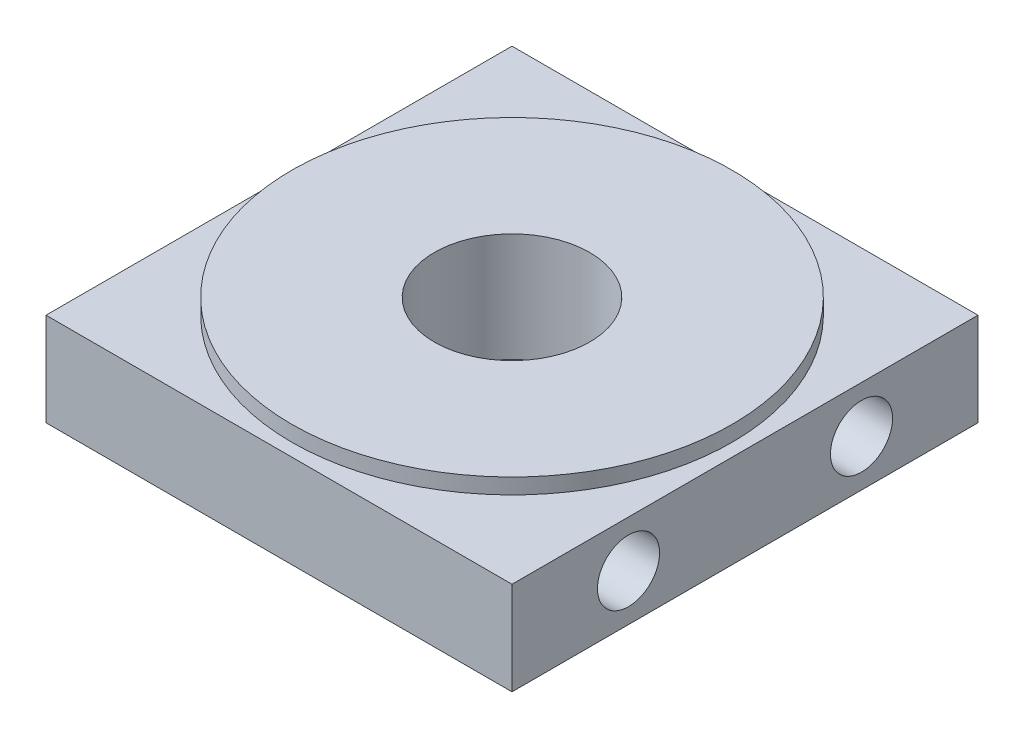
ISO-10303-21;
HEADER;
FILE_DESCRIPTION(('STEP AP214'),'2;1');
FILE_NAME('part.step','',(''),(''),'','','');
FILE_SCHEMA(('AUTOMOTIVE_DESIGN { 1 0 10303 214 1 1 1 1 }'));
ENDSEC;
DATA;
#1=APPLICATION_CONTEXT('core data for automotive mechanical design processes');
#2=APPLICATION_PROTOCOL_DEFINITION('international standard','automotive_design',2000,#1);
#3=PRODUCT_CONTEXT('',#1,'mechanical');
#4=PRODUCT('Part','Part','',(#3));
#5=PRODUCT_RELATED_PRODUCT_CATEGORY('part','',(#4));
#6=PRODUCT_DEFINITION_FORMATION('','',#4);
#7=PRODUCT_DEFINITION_CONTEXT('part definition',#1,'design');
#8=PRODUCT_DEFINITION('design','',#6,#7);
#9=PRODUCT_DEFINITION_SHAPE('','',#8);
#10=(LENGTH_UNIT() NAMED_UNIT(*) SI_UNIT(.MILLI.,.METRE.));
#11=(NAMED_UNIT(*) PLANE_ANGLE_UNIT() SI_UNIT($,.RADIAN.));
#12=(NAMED_UNIT(*) SI_UNIT($,.STERADIAN.) SOLID_ANGLE_UNIT());
#13=UNCERTAINTY_MEASURE_WITH_UNIT(LENGTH_MEASURE(1.E-05),#10,'distance_accuracy_value','');
#14=(GEOMETRIC_REPRESENTATION_CONTEXT(3) GLOBAL_UNCERTAINTY_ASSIGNED_CONTEXT((#13)) GLOBAL_UNIT_ASSIGNED_CONTEXT((#10,
#11,#12)) REPRESENTATION_CONTEXT('',''));
#15=CARTESIAN_POINT('',(0.,0.,0.));
#16=DIRECTION('',(0.,0.,1.));
#17=DIRECTION('',(1.,0.,0.));
#18=AXIS2_PLACEMENT_3D('',#15,#16,#17);
#19=CARTESIAN_POINT('',(18.1239583333333,7.62,-21.5635416666667));
#20=DIRECTION('',(-1.,0.,0.));
#21=DIRECTION('',(0.,0.,1.));
#22=AXIS2_PLACEMENT_3D('',#19,#20,#21);
#23=PLANE('',#22);
#24=CARTESIAN_POINT('',(18.1239583333333,3.81,-12.0385416666667));
#25=DIRECTION('',(1.,0.,0.));
#26=DIRECTION('',(0.,0.,-1.));
#27=AXIS2_PLACEMENT_3D('',#24,#25,#26);
#28=CIRCLE('',#27,2.54);
#29=CARTESIAN_POINT('',(18.1239583333333,3.81,-14.5785416666667));
#30=VERTEX_POINT('',#29);
#31=EDGE_CURVE('E139',#30,#30,#28,.T.);
#32=ORIENTED_EDGE('',*,*,#31,.F.);
#33=EDGE_LOOP('',(#32));
#34=FACE_BOUND('',#33,.T.);
#35=CARTESIAN_POINT('',(18.1239583333333,3.81,7.01145833333331));
#36=DIRECTION('',(1.,0.,0.));
#37=DIRECTION('',(0.,0.,-1.));
#38=AXIS2_PLACEMENT_3D('',#35,#36,#37);
#39=CIRCLE('',#38,2.54);
#40=CARTESIAN_POINT('',(18.1239583333333,3.81,4.47145833333331));
#41=VERTEX_POINT('',#40);
#42=EDGE_CURVE('E133',#41,#41,#39,.T.);
#43=ORIENTED_EDGE('',*,*,#42,.F.);
#44=EDGE_LOOP('',(#43));
#45=FACE_BOUND('',#44,.T.);
#46=DIRECTION('',(0.,0.,-1.));
#47=VECTOR('',#46,1.);
#48=CARTESIAN_POINT('',(18.1239583333333,0.,-21.5635416666667));
#49=LINE('',#48,#47);
#50=CARTESIAN_POINT('',(18.1239583333333,0.,16.5364583333333));
#51=VERTEX_POINT('',#50);
#52=CARTESIAN_POINT('',(18.1239583333333,0.,-21.5635416666667));
#53=VERTEX_POINT('',#52);
#54=EDGE_CURVE('E95',#51,#53,#49,.T.);
#55=ORIENTED_EDGE('',*,*,#54,.T.);
#56=DIRECTION('',(0.,-1.,0.));
#57=VECTOR('',#56,1.);
#58=CARTESIAN_POINT('',(18.1239583333333,7.62,-21.5635416666667));
#59=LINE('',#58,#57);
#60=CARTESIAN_POINT('',(18.1239583333333,7.62,-21.5635416666667));
#61=VERTEX_POINT('',#60);
#62=EDGE_CURVE('E11',#61,#53,#59,.T.);
#63=ORIENTED_EDGE('',*,*,#62,.F.);
#64=DIRECTION('',(0.,0.,-1.));
#65=VECTOR('',#64,1.);
#66=CARTESIAN_POINT('',(18.1239583333333,7.62,-21.5635416666667));
#67=LINE('',#66,#65);
#68=CARTESIAN_POINT('',(18.1239583333333,7.62,16.5364583333333));
#69=VERTEX_POINT('',#68);
#70=EDGE_CURVE('E83',#69,#61,#67,.T.);
#71=ORIENTED_EDGE('',*,*,#70,.F.);
#72=DIRECTION('',(0.,-1.,0.));
#73=VECTOR('',#72,1.);
#74=CARTESIAN_POINT('',(18.1239583333333,7.62,16.5364583333333));
#75=LINE('',#74,#73);
#76=EDGE_CURVE('E91',#69,#51,#75,.T.);
#77=ORIENTED_EDGE('',*,*,#76,.T.);
#78=EDGE_LOOP('',(#55,#63,#71,#77));
#79=FACE_BOUND('',#78,.T.);
#80=ADVANCED_FACE('F32',(#34,#45,#79),#23,.F.);
#81=CARTESIAN_POINT('',(-19.9760416666667,7.62,-21.5635416666667));
#82=DIRECTION('',(0.,0.,1.));
#83=DIRECTION('',(1.,0.,0.));
#84=AXIS2_PLACEMENT_3D('',#81,#82,#83);
#85=PLANE('',#84);
#86=DIRECTION('',(-1.,0.,0.));
#87=VECTOR('',#86,1.);
#88=CARTESIAN_POINT('',(-19.9760416666667,0.,-21.5635416666667));
#89=LINE('',#88,#87);
#90=CARTESIAN_POINT('',(-19.9760416666667,0.,-21.5635416666667));
#91=VERTEX_POINT('',#90);
#92=EDGE_CURVE('E87',#53,#91,#89,.T.);
#93=ORIENTED_EDGE('',*,*,#92,.T.);
#94=DIRECTION('',(0.,-1.,0.));
#95=VECTOR('',#94,1.);
#96=CARTESIAN_POINT('',(-19.9760416666667,7.62,-21.5635416666667));
#97=LINE('',#96,#95);
#98=CARTESIAN_POINT('',(-19.9760416666667,7.62,-21.5635416666667));
#99=VERTEX_POINT('',#98);
#100=EDGE_CURVE('E40',#99,#91,#97,.T.);
#101=ORIENTED_EDGE('',*,*,#100,.F.);
#102=DIRECTION('',(-1.,0.,0.));
#103=VECTOR('',#102,1.);
#104=CARTESIAN_POINT('',(-19.9760416666667,7.62,-21.5635416666667));
#105=LINE('',#104,#103);
#106=EDGE_CURVE('E78',#61,#99,#105,.T.);
#107=ORIENTED_EDGE('',*,*,#106,.F.);
#108=ORIENTED_EDGE('',*,*,#62,.T.);
#109=EDGE_LOOP('',(#93,#101,#107,#108));
#110=FACE_BOUND('',#109,.T.);
#111=ADVANCED_FACE('F86',(#110),#85,.F.);
#112=CARTESIAN_POINT('',(-19.9760416666667,7.62,-21.5635416666667));
#113=DIRECTION('',(1.,0.,0.));
#114=DIRECTION('',(0.,0.,-1.));
#115=AXIS2_PLACEMENT_3D('',#112,#113,#114);
#116=PLANE('',#115);
#117=CARTESIAN_POINT('',(-19.9760416666667,3.81,7.01145833333331));
#118=DIRECTION('',(-1.,0.,0.));
#119=DIRECTION('',(0.,0.,1.));
#120=AXIS2_PLACEMENT_3D('',#117,#118,#119);
#121=CIRCLE('',#120,2.54);
#122=CARTESIAN_POINT('',(-19.9760416666667,3.81,9.55145833333331));
#123=VERTEX_POINT('',#122);
#124=EDGE_CURVE('E127',#123,#123,#121,.T.);
#125=ORIENTED_EDGE('',*,*,#124,.F.);
#126=EDGE_LOOP('',(#125));
#127=FACE_BOUND('',#126,.T.);
#128=CARTESIAN_POINT('',(-19.9760416666667,3.81,-12.0385416666667));
#129=DIRECTION('',(-1.,0.,0.));
#130=DIRECTION('',(0.,0.,1.));
#131=AXIS2_PLACEMENT_3D('',#128,#129,#130);
#132=CIRCLE('',#131,2.54);
#133=CARTESIAN_POINT('',(-19.9760416666667,3.81,-9.49854166666669));
#134=VERTEX_POINT('',#133);
#135=EDGE_CURVE('E121',#134,#134,#132,.T.);
#136=ORIENTED_EDGE('',*,*,#135,.F.);
#137=EDGE_LOOP('',(#136));
#138=FACE_BOUND('',#137,.T.);
#139=DIRECTION('',(0.,0.,1.));
#140=VECTOR('',#139,1.);
#141=CARTESIAN_POINT('',(-19.9760416666667,0.,-21.5635416666667));
#142=LINE('',#141,#140);
#143=CARTESIAN_POINT('',(-19.9760416666667,0.,16.5364583333333));
#144=VERTEX_POINT('',#143);
#145=EDGE_CURVE('E65',#91,#144,#142,.T.);
#146=ORIENTED_EDGE('',*,*,#145,.T.);
#147=DIRECTION('',(0.,-1.,0.));
#148=VECTOR('',#147,1.);
#149=CARTESIAN_POINT('',(-19.9760416666667,7.62,16.5364583333333));
#150=LINE('',#149,#148);
#151=CARTESIAN_POINT('',(-19.9760416666667,7.62,16.5364583333333));
#152=VERTEX_POINT('',#151);
#153=EDGE_CURVE('E88',#152,#144,#150,.T.);
#154=ORIENTED_EDGE('',*,*,#153,.F.);
#155=DIRECTION('',(0.,0.,1.));
#156=VECTOR('',#155,1.);
#157=CARTESIAN_POINT('',(-19.9760416666667,7.62,-21.5635416666667));
#158=LINE('',#157,#156);
#159=EDGE_CURVE('E81',#99,#152,#158,.T.);
#160=ORIENTED_EDGE('',*,*,#159,.F.);
#161=ORIENTED_EDGE('',*,*,#100,.T.);
#162=EDGE_LOOP('',(#146,#154,#160,#161));
#163=FACE_BOUND('',#162,.T.);
#164=ADVANCED_FACE('F89',(#127,#138,#163),#116,.F.);
#165=CARTESIAN_POINT('',(-19.9760416666667,7.62,16.5364583333333));
#166=DIRECTION('',(0.,0.,-1.));
#167=DIRECTION('',(-1.,0.,0.));
#168=AXIS2_PLACEMENT_3D('',#165,#166,#167);
#169=PLANE('',#168);
#170=DIRECTION('',(1.,0.,0.));
#171=VECTOR('',#170,1.);
#172=CARTESIAN_POINT('',(-19.9760416666667,0.,16.5364583333333));
#173=LINE('',#172,#171);
#174=EDGE_CURVE('E71',#144,#51,#173,.T.);
#175=ORIENTED_EDGE('',*,*,#174,.T.);
#176=ORIENTED_EDGE('',*,*,#76,.F.);
#177=DIRECTION('',(1.,0.,0.));
#178=VECTOR('',#177,1.);
#179=CARTESIAN_POINT('',(-19.9760416666667,7.62,16.5364583333333));
#180=LINE('',#179,#178);
#181=EDGE_CURVE('E48',#152,#69,#180,.T.);
#182=ORIENTED_EDGE('',*,*,#181,.F.);
#183=ORIENTED_EDGE('',*,*,#153,.T.);
#184=EDGE_LOOP('',(#175,#176,#182,#183));
#185=FACE_BOUND('',#184,.T.);
#186=ADVANCED_FACE('F103',(#185),#169,.F.);
#187=CARTESIAN_POINT('',(0.,7.62,0.));
#188=DIRECTION('',(0.,1.,0.));
#189=DIRECTION('',(0.,0.,1.));
#190=AXIS2_PLACEMENT_3D('',#187,#188,#189);
#191=PLANE('',#190);
#192=CARTESIAN_POINT('',(-0.926041666666669,7.62,-2.51354166666669));
#193=DIRECTION('',(0.,1.,0.));
#194=DIRECTION('',(0.,0.,1.));
#195=AXIS2_PLACEMENT_3D('',#192,#193,#194);
#196=CIRCLE('',#195,18.);
#197=CARTESIAN_POINT('',(-0.926041666666669,7.62,15.4864583333333));
#198=VERTEX_POINT('',#197);
#199=EDGE_CURVE('E109',#198,#198,#196,.T.);
#200=ORIENTED_EDGE('',*,*,#199,.F.);
#201=EDGE_LOOP('',(#200));
#202=FACE_BOUND('',#201,.T.);
#203=ORIENTED_EDGE('',*,*,#70,.T.);
#204=ORIENTED_EDGE('',*,*,#106,.T.);
#205=ORIENTED_EDGE('',*,*,#159,.T.);
#206=ORIENTED_EDGE('',*,*,#181,.T.);
#207=EDGE_LOOP('',(#203,#204,#205,#206));
#208=FACE_BOUND('',#207,.T.);
#209=ADVANCED_FACE('F79',(#202,#208),#191,.T.);
#210=CARTESIAN_POINT('',(0.,0.,0.));
#211=DIRECTION('',(0.,1.,0.));
#212=DIRECTION('',(0.,0.,1.));
#213=AXIS2_PLACEMENT_3D('',#210,#211,#212);
#214=PLANE('',#213);
#215=CARTESIAN_POINT('',(-0.926041666666669,0.,-2.51354166666669));
#216=DIRECTION('',(0.,1.,0.));
#217=DIRECTION('',(0.,0.,1.));
#218=AXIS2_PLACEMENT_3D('',#215,#216,#217);
#219=CIRCLE('',#218,6.35);
#220=CARTESIAN_POINT('',(-0.926041666666669,0.,3.83645833333331));
#221=VERTEX_POINT('',#220);
#222=EDGE_CURVE('E117',#221,#221,#219,.T.);
#223=ORIENTED_EDGE('',*,*,#222,.T.);
#224=EDGE_LOOP('',(#223));
#225=FACE_BOUND('',#224,.T.);
#226=ORIENTED_EDGE('',*,*,#54,.F.);
#227=ORIENTED_EDGE('',*,*,#174,.F.);
#228=ORIENTED_EDGE('',*,*,#145,.F.);
#229=ORIENTED_EDGE('',*,*,#92,.F.);
#230=EDGE_LOOP('',(#226,#227,#228,#229));
#231=FACE_BOUND('',#230,.T.);
#232=ADVANCED_FACE('F106',(#225,#231),#214,.F.);
#233=CARTESIAN_POINT('',(-0.926041666666669,8.89,-2.51354166666669));
#234=DIRECTION('',(0.,1.,0.));
#235=DIRECTION('',(0.,0.,1.));
#236=AXIS2_PLACEMENT_3D('',#233,#234,#235);
#237=PLANE('',#236);
#238=CARTESIAN_POINT('',(-0.926041666666669,8.89,-2.51354166666669));
#239=DIRECTION('',(0.,1.,0.));
#240=DIRECTION('',(0.,0.,1.));
#241=AXIS2_PLACEMENT_3D('',#238,#239,#240);
#242=CIRCLE('',#241,18.);
#243=CARTESIAN_POINT('',(-0.926041666666669,8.89,15.4864583333333));
#244=VERTEX_POINT('',#243);
#245=EDGE_CURVE('E98',#244,#244,#242,.T.);
#246=ORIENTED_EDGE('',*,*,#245,.T.);
#247=EDGE_LOOP('',(#246));
#248=FACE_BOUND('',#247,.T.);
#249=CARTESIAN_POINT('',(-0.926041666666669,8.89,-2.51354166666669));
#250=DIRECTION('',(0.,1.,0.));
#251=DIRECTION('',(0.,0.,1.));
#252=AXIS2_PLACEMENT_3D('',#249,#250,#251);
#253=CIRCLE('',#252,6.35);
#254=CARTESIAN_POINT('',(-0.926041666666669,8.89,3.83645833333331));
#255=VERTEX_POINT('',#254);
#256=EDGE_CURVE('E112',#255,#255,#253,.T.);
#257=ORIENTED_EDGE('',*,*,#256,.F.);
#258=EDGE_LOOP('',(#257));
#259=FACE_BOUND('',#258,.T.);
#260=ADVANCED_FACE('F190',(#248,#259),#237,.T.);
#261=CARTESIAN_POINT('',(-0.926041666666669,8.89,-2.51354166666669));
#262=DIRECTION('',(0.,-1.,0.));
#263=DIRECTION('',(0.,0.,-1.));
#264=AXIS2_PLACEMENT_3D('',#261,#262,#263);
#265=CYLINDRICAL_SURFACE('',#264,18.);
#266=ORIENTED_EDGE('',*,*,#245,.F.);
#267=EDGE_LOOP('',(#266));
#268=FACE_BOUND('',#267,.T.);
#269=ORIENTED_EDGE('',*,*,#199,.T.);
#270=EDGE_LOOP('',(#269));
#271=FACE_BOUND('',#270,.T.);
#272=ADVANCED_FACE('F188',(#268,#271),#265,.T.);
#273=CARTESIAN_POINT('',(-0.926041666666669,8.89,-2.51354166666669));
#274=DIRECTION('',(0.,-1.,0.));
#275=DIRECTION('',(0.,0.,-1.));
#276=AXIS2_PLACEMENT_3D('',#273,#274,#275);
#277=CYLINDRICAL_SURFACE('',#276,6.35);
#278=ORIENTED_EDGE('',*,*,#256,.T.);
#279=EDGE_LOOP('',(#278));
#280=FACE_BOUND('',#279,.T.);
#281=ORIENTED_EDGE('',*,*,#222,.F.);
#282=EDGE_LOOP('',(#281));
#283=FACE_BOUND('',#282,.T.);
#284=ADVANCED_FACE('F184',(#280,#283),#277,.F.);
#285=CARTESIAN_POINT('',(-12.3560416666667,3.81,-12.0385416666667));
#286=DIRECTION('',(-1.,0.,0.));
#287=DIRECTION('',(0.,0.,1.));
#288=AXIS2_PLACEMENT_3D('',#285,#286,#287);
#289=CYLINDRICAL_SURFACE('',#288,2.54);
#290=CARTESIAN_POINT('',(-12.3560416666667,3.81,-12.0385416666667));
#291=DIRECTION('',(-1.,0.,0.));
#292=DIRECTION('',(0.,0.,1.));
#293=AXIS2_PLACEMENT_3D('',#290,#291,#292);
#294=CIRCLE('',#293,2.54);
#295=CARTESIAN_POINT('',(-12.3560416666667,3.81,-9.49854166666669));
#296=VERTEX_POINT('',#295);
#297=EDGE_CURVE('E120',#296,#296,#294,.T.);
#298=CARTESIAN_POINT('',(-12.3560416666667,3.81,-9.49854166666669));
#299=CARTESIAN_POINT('',(-12.4354166666667,3.81,-9.49854166666669));
#300=CARTESIAN_POINT('',(-12.5147916666667,3.81,-9.49854166666669));
#301=CARTESIAN_POINT('',(-12.6735416666667,3.81,-9.49854166666669));
#302=CARTESIAN_POINT('',(-12.7529166666667,3.81,-9.49854166666669));
#303=CARTESIAN_POINT('',(-12.9116666666667,3.81,-9.49854166666669));
#304=CARTESIAN_POINT('',(-12.9910416666667,3.81,-9.49854166666669));
#305=CARTESIAN_POINT('',(-13.1497916666667,3.81,-9.49854166666669));
#306=CARTESIAN_POINT('',(-13.2291666666667,3.81,-9.49854166666669));
#307=CARTESIAN_POINT('',(-13.3879166666667,3.81,-9.49854166666669));
#308=CARTESIAN_POINT('',(-13.4672916666667,3.81,-9.49854166666669));
#309=CARTESIAN_POINT('',(-13.6260416666667,3.81,-9.49854166666669));
#310=CARTESIAN_POINT('',(-13.7054166666667,3.81,-9.49854166666669));
#311=CARTESIAN_POINT('',(-13.8641666666667,3.81,-9.49854166666669));
#312=CARTESIAN_POINT('',(-13.9435416666667,3.81,-9.49854166666669));
#313=CARTESIAN_POINT('',(-14.1022916666667,3.81,-9.49854166666669));
#314=CARTESIAN_POINT('',(-14.1816666666667,3.81,-9.49854166666669));
#315=CARTESIAN_POINT('',(-14.3404166666667,3.81,-9.49854166666669));
#316=CARTESIAN_POINT('',(-14.4197916666667,3.81,-9.49854166666669));
#317=CARTESIAN_POINT('',(-14.5785416666667,3.81,-9.49854166666669));
#318=CARTESIAN_POINT('',(-14.6579166666667,3.81,-9.49854166666669));
#319=CARTESIAN_POINT('',(-14.8166666666667,3.81,-9.49854166666669));
#320=CARTESIAN_POINT('',(-14.8960416666667,3.81,-9.49854166666669));
#321=CARTESIAN_POINT('',(-15.0547916666667,3.81,-9.49854166666669));
#322=CARTESIAN_POINT('',(-15.1341666666667,3.81,-9.49854166666669));
#323=CARTESIAN_POINT('',(-15.2929166666667,3.81,-9.49854166666669));
#324=CARTESIAN_POINT('',(-15.3722916666667,3.81,-9.49854166666669));
#325=CARTESIAN_POINT('',(-15.5310416666667,3.81,-9.49854166666669));
#326=CARTESIAN_POINT('',(-15.6104166666667,3.81,-9.49854166666669));
#327=CARTESIAN_POINT('',(-15.7691666666667,3.81,-9.49854166666669));
#328=CARTESIAN_POINT('',(-15.8485416666667,3.81,-9.49854166666669));
#329=CARTESIAN_POINT('',(-16.0072916666667,3.81,-9.49854166666669));
#330=CARTESIAN_POINT('',(-16.0866666666667,3.81,-9.49854166666669));
#331=CARTESIAN_POINT('',(-16.2454166666667,3.81,-9.49854166666669));
#332=CARTESIAN_POINT('',(-16.3247916666667,3.81,-9.49854166666669));
#333=CARTESIAN_POINT('',(-16.4835416666667,3.81,-9.49854166666669));
#334=CARTESIAN_POINT('',(-16.5629166666667,3.81,-9.49854166666669));
#335=CARTESIAN_POINT('',(-16.7216666666667,3.81,-9.49854166666669));
#336=CARTESIAN_POINT('',(-16.8010416666667,3.81,-9.49854166666669));
#337=CARTESIAN_POINT('',(-16.9597916666667,3.81,-9.49854166666669));
#338=CARTESIAN_POINT('',(-17.0391666666667,3.81,-9.49854166666669));
#339=CARTESIAN_POINT('',(-17.1979166666667,3.81,-9.49854166666669));
#340=CARTESIAN_POINT('',(-17.2772916666667,3.81,-9.49854166666669));
#341=CARTESIAN_POINT('',(-17.4360416666667,3.81,-9.49854166666669));
#342=CARTESIAN_POINT('',(-17.5154166666667,3.81,-9.49854166666669));
#343=CARTESIAN_POINT('',(-17.6741666666667,3.81,-9.49854166666669));
#344=CARTESIAN_POINT('',(-17.7535416666667,3.81,-9.49854166666669));
#345=CARTESIAN_POINT('',(-17.9122916666667,3.81,-9.49854166666669));
#346=CARTESIAN_POINT('',(-17.9916666666667,3.81,-9.49854166666669));
#347=CARTESIAN_POINT('',(-18.1504166666667,3.81,-9.49854166666669));
#348=CARTESIAN_POINT('',(-18.2297916666667,3.81,-9.49854166666669));
#349=CARTESIAN_POINT('',(-18.3885416666667,3.81,-9.49854166666669));
#350=CARTESIAN_POINT('',(-18.4679166666667,3.81,-9.49854166666669));
#351=CARTESIAN_POINT('',(-18.6266666666667,3.81,-9.49854166666669));
#352=CARTESIAN_POINT('',(-18.7060416666667,3.81,-9.49854166666669));
#353=CARTESIAN_POINT('',(-18.8647916666667,3.81,-9.49854166666669));
#354=CARTESIAN_POINT('',(-18.9441666666667,3.81,-9.49854166666669));
#355=CARTESIAN_POINT('',(-19.1029166666667,3.81,-9.49854166666669));
#356=CARTESIAN_POINT('',(-19.1822916666667,3.81,-9.49854166666669));
#357=CARTESIAN_POINT('',(-19.3410416666667,3.81,-9.49854166666669));
#358=CARTESIAN_POINT('',(-19.4204166666667,3.81,-9.49854166666669));
#359=CARTESIAN_POINT('',(-19.5791666666667,3.81,-9.49854166666669));
#360=CARTESIAN_POINT('',(-19.6585416666667,3.81,-9.49854166666669));
#361=CARTESIAN_POINT('',(-19.8172916666667,3.81,-9.49854166666669));
#362=CARTESIAN_POINT('',(-19.8966666666667,3.81,-9.49854166666669));
#363=CARTESIAN_POINT('',(-19.9760416666667,3.81,-9.49854166666669));
#364=B_SPLINE_CURVE_WITH_KNOTS('',3,(#298,#299,#300,#301,#302,#303,#304,#305,#306,#307,#308,
#309,#310,#311,#312,#313,#314,#315,#316,#317,#318,#319,#320,#321,#322,#323,#324,#325,#326,#327,
#328,#329,#330,#331,#332,#333,#334,#335,#336,#337,#338,#339,#340,#341,#342,#343,#344,#345,#346,
#347,#348,#349,#350,#351,#352,#353,#354,#355,#356,#357,#358,#359,#360,#361,#362,#363),
.UNSPECIFIED.,.F.,.F.,(4,2,2,2,2,2,2,2,2,2,2,2,2,2,2,2,2,2,2,2,2,2,2,2,2,2,2,2,2,2,2,2,4),(0.,
0.238125,0.476250000000001,0.714375,0.9525,1.190625,1.42875,1.666875,1.905,2.143125,2.38125,
2.619375,2.8575,3.095625,3.33375,3.571875,3.81,4.048125,4.28625,4.524375,4.7625,5.000625,
5.23875,5.476875,5.715,5.953125,6.19125,6.429375,6.6675,6.905625,7.14375,7.381875,7.62),.UNSPECIFIED.);
#365=EDGE_CURVE('BSEAM180',#296,#134,#364,.T.);
#366=ORIENTED_EDGE('',*,*,#297,.F.);
#367=ORIENTED_EDGE('',*,*,#135,.T.);
#368=ORIENTED_EDGE('',*,*,#365,.T.);
#369=ORIENTED_EDGE('',*,*,#365,.F.);
#370=EDGE_LOOP('',(#366,#368,#367,#369));
#371=FACE_BOUND('',#370,.T.);
#372=ADVANCED_FACE('F180',(#371),#289,.F.);
#373=CARTESIAN_POINT('',(-12.3560416666667,3.81,-12.0385416666667));
#374=DIRECTION('',(-1.,0.,0.));
#375=DIRECTION('',(0.,0.,1.));
#376=AXIS2_PLACEMENT_3D('',#373,#374,#375);
#377=PLANE('',#376);
#378=ORIENTED_EDGE('',*,*,#297,.T.);
#379=EDGE_LOOP('',(#378));
#380=FACE_BOUND('',#379,.T.);
#381=ADVANCED_FACE('F176',(#380),#377,.T.);
#382=CARTESIAN_POINT('',(-12.3560416666667,3.81,7.01145833333331));
#383=DIRECTION('',(-1.,0.,0.));
#384=DIRECTION('',(0.,0.,1.));
#385=AXIS2_PLACEMENT_3D('',#382,#383,#384);
#386=CYLINDRICAL_SURFACE('',#385,2.54);
#387=CARTESIAN_POINT('',(-12.3560416666667,3.81,7.01145833333331));
#388=DIRECTION('',(-1.,0.,0.));
#389=DIRECTION('',(0.,0.,1.));
#390=AXIS2_PLACEMENT_3D('',#387,#388,#389);
#391=CIRCLE('',#390,2.54);
#392=CARTESIAN_POINT('',(-12.3560416666667,3.81,9.55145833333331));
#393=VERTEX_POINT('',#392);
#394=EDGE_CURVE('E124',#393,#393,#391,.T.);
#395=CARTESIAN_POINT('',(-12.3560416666667,3.81,9.55145833333331));
#396=CARTESIAN_POINT('',(-12.4354166666667,3.81,9.55145833333331));
#397=CARTESIAN_POINT('',(-12.5147916666667,3.81,9.55145833333331));
#398=CARTESIAN_POINT('',(-12.6735416666667,3.81,9.55145833333331));
#399=CARTESIAN_POINT('',(-12.7529166666667,3.81,9.55145833333331));
#400=CARTESIAN_POINT('',(-12.9116666666667,3.81,9.55145833333331));
#401=CARTESIAN_POINT('',(-12.9910416666667,3.81,9.55145833333331));
#402=CARTESIAN_POINT('',(-13.1497916666667,3.81,9.55145833333331));
#403=CARTESIAN_POINT('',(-13.2291666666667,3.81,9.55145833333331));
#404=CARTESIAN_POINT('',(-13.3879166666667,3.81,9.55145833333331));
#405=CARTESIAN_POINT('',(-13.4672916666667,3.81,9.55145833333331));
#406=CARTESIAN_POINT('',(-13.6260416666667,3.81,9.55145833333331));
#407=CARTESIAN_POINT('',(-13.7054166666667,3.81,9.55145833333331));
#408=CARTESIAN_POINT('',(-13.8641666666667,3.81,9.55145833333331));
#409=CARTESIAN_POINT('',(-13.9435416666667,3.81,9.55145833333331));
#410=CARTESIAN_POINT('',(-14.1022916666667,3.81,9.55145833333331));
#411=CARTESIAN_POINT('',(-14.1816666666667,3.81,9.55145833333331));
#412=CARTESIAN_POINT('',(-14.3404166666667,3.81,9.55145833333331));
#413=CARTESIAN_POINT('',(-14.4197916666667,3.81,9.55145833333331));
#414=CARTESIAN_POINT('',(-14.5785416666667,3.81,9.55145833333331));
#415=CARTESIAN_POINT('',(-14.6579166666667,3.81,9.55145833333331));
#416=CARTESIAN_POINT('',(-14.8166666666667,3.81,9.55145833333331));
#417=CARTESIAN_POINT('',(-14.8960416666667,3.81,9.55145833333331));
#418=CARTESIAN_POINT('',(-15.0547916666667,3.81,9.55145833333331));
#419=CARTESIAN_POINT('',(-15.1341666666667,3.81,9.55145833333331));
#420=CARTESIAN_POINT('',(-15.2929166666667,3.81,9.55145833333331));
#421=CARTESIAN_POINT('',(-15.3722916666667,3.81,9.55145833333331));
#422=CARTESIAN_POINT('',(-15.5310416666667,3.81,9.55145833333331));
#423=CARTESIAN_POINT('',(-15.6104166666667,3.81,9.55145833333331));
#424=CARTESIAN_POINT('',(-15.7691666666667,3.81,9.55145833333331));
#425=CARTESIAN_POINT('',(-15.8485416666667,3.81,9.55145833333331));
#426=CARTESIAN_POINT('',(-16.0072916666667,3.81,9.55145833333331));
#427=CARTESIAN_POINT('',(-16.0866666666667,3.81,9.55145833333331));
#428=CARTESIAN_POINT('',(-16.2454166666667,3.81,9.55145833333331));
#429=CARTESIAN_POINT('',(-16.3247916666667,3.81,9.55145833333331));
#430=CARTESIAN_POINT('',(-16.4835416666667,3.81,9.55145833333331));
#431=CARTESIAN_POINT('',(-16.5629166666667,3.81,9.55145833333331));
#432=CARTESIAN_POINT('',(-16.7216666666667,3.81,9.55145833333331));
#433=CARTESIAN_POINT('',(-16.8010416666667,3.81,9.55145833333331));
#434=CARTESIAN_POINT('',(-16.9597916666667,3.81,9.55145833333331));
#435=CARTESIAN_POINT('',(-17.0391666666667,3.81,9.55145833333331));
#436=CARTESIAN_POINT('',(-17.1979166666667,3.81,9.55145833333331));
#437=CARTESIAN_POINT('',(-17.2772916666667,3.81,9.55145833333331));
#438=CARTESIAN_POINT('',(-17.4360416666667,3.81,9.55145833333331));
#439=CARTESIAN_POINT('',(-17.5154166666667,3.81,9.55145833333331));
#440=CARTESIAN_POINT('',(-17.6741666666667,3.81,9.55145833333331));
#441=CARTESIAN_POINT('',(-17.7535416666667,3.81,9.55145833333331));
#442=CARTESIAN_POINT('',(-17.9122916666667,3.81,9.55145833333331));
#443=CARTESIAN_POINT('',(-17.9916666666667,3.81,9.55145833333331));
#444=CARTESIAN_POINT('',(-18.1504166666667,3.81,9.55145833333331));
#445=CARTESIAN_POINT('',(-18.2297916666667,3.81,9.55145833333331));
#446=CARTESIAN_POINT('',(-18.3885416666667,3.81,9.55145833333331));
#447=CARTESIAN_POINT('',(-18.4679166666667,3.81,9.55145833333331));
#448=CARTESIAN_POINT('',(-18.6266666666667,3.81,9.55145833333331));
#449=CARTESIAN_POINT('',(-18.7060416666667,3.81,9.55145833333331));
#450=CARTESIAN_POINT('',(-18.8647916666667,3.81,9.55145833333331));
#451=CARTESIAN_POINT('',(-18.9441666666667,3.81,9.55145833333331));
#452=CARTESIAN_POINT('',(-19.1029166666667,3.81,9.55145833333331));
#453=CARTESIAN_POINT('',(-19.1822916666667,3.81,9.55145833333331));
#454=CARTESIAN_POINT('',(-19.3410416666667,3.81,9.55145833333331));
#455=CARTESIAN_POINT('',(-19.4204166666667,3.81,9.55145833333331));
#456=CARTESIAN_POINT('',(-19.5791666666667,3.81,9.55145833333331));
#457=CARTESIAN_POINT('',(-19.6585416666667,3.81,9.55145833333331));
#458=CARTESIAN_POINT('',(-19.8172916666667,3.81,9.55145833333331));
#459=CARTESIAN_POINT('',(-19.8966666666667,3.81,9.55145833333331));
#460=CARTESIAN_POINT('',(-19.9760416666667,3.81,9.55145833333331));
#461=B_SPLINE_CURVE_WITH_KNOTS('',3,(#395,#396,#397,#398,#399,#400,#401,#402,#403,#404,#405,
#406,#407,#408,#409,#410,#411,#412,#413,#414,#415,#416,#417,#418,#419,#420,#421,#422,#423,#424,
#425,#426,#427,#428,#429,#430,#431,#432,#433,#434,#435,#436,#437,#438,#439,#440,#441,#442,#443,
#444,#445,#446,#447,#448,#449,#450,#451,#452,#453,#454,#455,#456,#457,#458,#459,#460),
.UNSPECIFIED.,.F.,.F.,(4,2,2,2,2,2,2,2,2,2,2,2,2,2,2,2,2,2,2,2,2,2,2,2,2,2,2,2,2,2,2,2,4),(0.,
0.238125,0.476250000000001,0.714375,0.9525,1.190625,1.42875,1.666875,1.905,2.143125,2.38125,
2.619375,2.8575,3.095625,3.33375,3.571875,3.81,4.048125,4.28625,4.524375,4.7625,5.000625,
5.23875,5.476875,5.715,5.953125,6.19125,6.429375,6.6675,6.905625,7.14375,7.381875,7.62),.UNSPECIFIED.);
#462=EDGE_CURVE('BSEAM169',#393,#123,#461,.T.);
#463=ORIENTED_EDGE('',*,*,#394,.F.);
#464=ORIENTED_EDGE('',*,*,#124,.T.);
#465=ORIENTED_EDGE('',*,*,#462,.T.);
#466=ORIENTED_EDGE('',*,*,#462,.F.);
#467=EDGE_LOOP('',(#463,#465,#464,#466));
#468=FACE_BOUND('',#467,.T.);
#469=ADVANCED_FACE('F169',(#468),#386,.F.);
#470=CARTESIAN_POINT('',(-12.3560416666667,3.81,7.01145833333331));
#471=DIRECTION('',(-1.,0.,0.));
#472=DIRECTION('',(0.,0.,1.));
#473=AXIS2_PLACEMENT_3D('',#470,#471,#472);
#474=PLANE('',#473);
#475=ORIENTED_EDGE('',*,*,#394,.T.);
#476=EDGE_LOOP('',(#475));
#477=FACE_BOUND('',#476,.T.);
#478=ADVANCED_FACE('F160',(#477),#474,.T.);
#479=CARTESIAN_POINT('',(10.5039583333333,3.81,7.01145833333331));
#480=DIRECTION('',(1.,0.,0.));
#481=DIRECTION('',(0.,0.,-1.));
#482=AXIS2_PLACEMENT_3D('',#479,#480,#481);
#483=CYLINDRICAL_SURFACE('',#482,2.54);
#484=CARTESIAN_POINT('',(10.5039583333333,3.81,7.01145833333331));
#485=DIRECTION('',(1.,0.,0.));
#486=DIRECTION('',(0.,0.,-1.));
#487=AXIS2_PLACEMENT_3D('',#484,#485,#486);
#488=CIRCLE('',#487,2.54);
#489=CARTESIAN_POINT('',(10.5039583333333,3.81,4.47145833333331));
#490=VERTEX_POINT('',#489);
#491=EDGE_CURVE('E130',#490,#490,#488,.T.);
#492=CARTESIAN_POINT('',(10.5039583333333,3.81,4.47145833333331));
#493=CARTESIAN_POINT('',(10.5833333333333,3.81,4.47145833333331));
#494=CARTESIAN_POINT('',(10.6627083333333,3.81,4.47145833333331));
#495=CARTESIAN_POINT('',(10.8214583333333,3.81,4.47145833333331));
#496=CARTESIAN_POINT('',(10.9008333333333,3.81,4.47145833333331));
#497=CARTESIAN_POINT('',(11.0595833333333,3.81,4.47145833333331));
#498=CARTESIAN_POINT('',(11.1389583333333,3.81,4.47145833333331));
#499=CARTESIAN_POINT('',(11.2977083333333,3.81,4.47145833333331));
#500=CARTESIAN_POINT('',(11.3770833333333,3.81,4.47145833333331));
#501=CARTESIAN_POINT('',(11.5358333333333,3.81,4.47145833333331));
#502=CARTESIAN_POINT('',(11.6152083333333,3.81,4.47145833333331));
#503=CARTESIAN_POINT('',(11.7739583333333,3.81,4.47145833333331));
#504=CARTESIAN_POINT('',(11.8533333333333,3.81,4.47145833333331));
#505=CARTESIAN_POINT('',(12.0120833333333,3.81,4.47145833333331));
#506=CARTESIAN_POINT('',(12.0914583333333,3.81,4.47145833333331));
#507=CARTESIAN_POINT('',(12.2502083333333,3.81,4.47145833333331));
#508=CARTESIAN_POINT('',(12.3295833333333,3.81,4.47145833333331));
#509=CARTESIAN_POINT('',(12.4883333333333,3.81,4.47145833333331));
#510=CARTESIAN_POINT('',(12.5677083333333,3.81,4.47145833333331));
#511=CARTESIAN_POINT('',(12.7264583333333,3.81,4.47145833333331));
#512=CARTESIAN_POINT('',(12.8058333333333,3.81,4.47145833333331));
#513=CARTESIAN_POINT('',(12.9645833333333,3.81,4.47145833333331));
#514=CARTESIAN_POINT('',(13.0439583333333,3.81,4.47145833333331));
#515=CARTESIAN_POINT('',(13.2027083333333,3.81,4.47145833333331));
#516=CARTESIAN_POINT('',(13.2820833333333,3.81,4.47145833333331));
#517=CARTESIAN_POINT('',(13.4408333333333,3.81,4.47145833333331));
#518=CARTESIAN_POINT('',(13.5202083333333,3.81,4.47145833333331));
#519=CARTESIAN_POINT('',(13.6789583333333,3.81,4.47145833333331));
#520=CARTESIAN_POINT('',(13.7583333333333,3.81,4.47145833333331));
#521=CARTESIAN_POINT('',(13.9170833333333,3.81,4.47145833333331));
#522=CARTESIAN_POINT('',(13.9964583333333,3.81,4.47145833333331));
#523=CARTESIAN_POINT('',(14.1552083333333,3.81,4.47145833333331));
#524=CARTESIAN_POINT('',(14.2345833333333,3.81,4.47145833333331));
#525=CARTESIAN_POINT('',(14.3933333333333,3.81,4.47145833333331));
#526=CARTESIAN_POINT('',(14.4727083333333,3.81,4.47145833333331));
#527=CARTESIAN_POINT('',(14.6314583333333,3.81,4.47145833333331));
#528=CARTESIAN_POINT('',(14.7108333333333,3.81,4.47145833333331));
#529=CARTESIAN_POINT('',(14.8695833333333,3.81,4.47145833333331));
#530=CARTESIAN_POINT('',(14.9489583333333,3.81,4.47145833333331));
#531=CARTESIAN_POINT('',(15.1077083333333,3.81,4.47145833333331));
#532=CARTESIAN_POINT('',(15.1870833333333,3.81,4.47145833333331));
#533=CARTESIAN_POINT('',(15.3458333333333,3.81,4.47145833333331));
#534=CARTESIAN_POINT('',(15.4252083333333,3.81,4.47145833333331));
#535=CARTESIAN_POINT('',(15.5839583333333,3.81,4.47145833333331));
#536=CARTESIAN_POINT('',(15.6633333333333,3.81,4.47145833333331));
#537=CARTESIAN_POINT('',(15.8220833333333,3.81,4.47145833333331));
#538=CARTESIAN_POINT('',(15.9014583333333,3.81,4.47145833333331));
#539=CARTESIAN_POINT('',(16.0602083333333,3.81,4.47145833333331));
#540=CARTESIAN_POINT('',(16.1395833333333,3.81,4.47145833333331));
#541=CARTESIAN_POINT('',(16.2983333333333,3.81,4.47145833333331));
#542=CARTESIAN_POINT('',(16.3777083333333,3.81,4.47145833333331));
#543=CARTESIAN_POINT('',(16.5364583333333,3.81,4.47145833333331));
#544=CARTESIAN_POINT('',(16.6158333333333,3.81,4.47145833333331));
#545=CARTESIAN_POINT('',(16.7745833333333,3.81,4.47145833333331));
#546=CARTESIAN_POINT('',(16.8539583333333,3.81,4.47145833333331));
#547=CARTESIAN_POINT('',(17.0127083333333,3.81,4.47145833333331));
#548=CARTESIAN_POINT('',(17.0920833333333,3.81,4.47145833333331));
#549=CARTESIAN_POINT('',(17.2508333333333,3.81,4.47145833333331));
#550=CARTESIAN_POINT('',(17.3302083333333,3.81,4.47145833333331));
#551=CARTESIAN_POINT('',(17.4889583333333,3.81,4.47145833333331));
#552=CARTESIAN_POINT('',(17.5683333333333,3.81,4.47145833333331));
#553=CARTESIAN_POINT('',(17.7270833333333,3.81,4.47145833333331));
#554=CARTESIAN_POINT('',(17.8064583333333,3.81,4.47145833333331));
#555=CARTESIAN_POINT('',(17.9652083333333,3.81,4.47145833333331));
#556=CARTESIAN_POINT('',(18.0445833333333,3.81,4.47145833333331));
#557=CARTESIAN_POINT('',(18.1239583333333,3.81,4.47145833333331));
#558=B_SPLINE_CURVE_WITH_KNOTS('',3,(#492,#493,#494,#495,#496,#497,#498,#499,#500,#501,#502,
#503,#504,#505,#506,#507,#508,#509,#510,#511,#512,#513,#514,#515,#516,#517,#518,#519,#520,#521,
#522,#523,#524,#525,#526,#527,#528,#529,#530,#531,#532,#533,#534,#535,#536,#537,#538,#539,#540,
#541,#542,#543,#544,#545,#546,#547,#548,#549,#550,#551,#552,#553,#554,#555,#556,#557),
.UNSPECIFIED.,.F.,.F.,(4,2,2,2,2,2,2,2,2,2,2,2,2,2,2,2,2,2,2,2,2,2,2,2,2,2,2,2,2,2,2,2,4),(0.,
0.238125,0.476250000000001,0.714375,0.9525,1.190625,1.42875,1.666875,1.905,2.143125,2.38125,
2.619375,2.8575,3.095625,3.33375,3.571875,3.81,4.048125,4.28625,4.524375,4.7625,5.000625,
5.23875,5.476875,5.715,5.953125,6.19125,6.429375,6.6675,6.905625,7.14375,7.381875,7.62),.UNSPECIFIED.);
#559=EDGE_CURVE('BSEAM158',#490,#41,#558,.T.);
#560=ORIENTED_EDGE('',*,*,#491,.F.);
#561=ORIENTED_EDGE('',*,*,#42,.T.);
#562=ORIENTED_EDGE('',*,*,#559,.T.);
#563=ORIENTED_EDGE('',*,*,#559,.F.);
#564=EDGE_LOOP('',(#560,#562,#561,#563));
#565=FACE_BOUND('',#564,.T.);
#566=ADVANCED_FACE('F158',(#565),#483,.F.);
#567=CARTESIAN_POINT('',(10.5039583333333,3.81,7.01145833333331));
#568=DIRECTION('',(1.,0.,0.));
#569=DIRECTION('',(0.,0.,-1.));
#570=AXIS2_PLACEMENT_3D('',#567,#568,#569);
#571=PLANE('',#570);
#572=ORIENTED_EDGE('',*,*,#491,.T.);
#573=EDGE_LOOP('',(#572));
#574=FACE_BOUND('',#573,.T.);
#575=ADVANCED_FACE('F150',(#574),#571,.T.);
#576=CARTESIAN_POINT('',(10.5039583333333,3.81,-12.0385416666667));
#577=DIRECTION('',(1.,0.,0.));
#578=DIRECTION('',(0.,0.,-1.));
#579=AXIS2_PLACEMENT_3D('',#576,#577,#578);
#580=CYLINDRICAL_SURFACE('',#579,2.54);
#581=CARTESIAN_POINT('',(10.5039583333333,3.81,-12.0385416666667));
#582=DIRECTION('',(1.,0.,0.));
#583=DIRECTION('',(0.,0.,-1.));
#584=AXIS2_PLACEMENT_3D('',#581,#582,#583);
#585=CIRCLE('',#584,2.54);
#586=CARTESIAN_POINT('',(10.5039583333333,3.81,-14.5785416666667));
#587=VERTEX_POINT('',#586);
#588=EDGE_CURVE('E136',#587,#587,#585,.T.);
#589=CARTESIAN_POINT('',(10.5039583333333,3.81,-14.5785416666667));
#590=CARTESIAN_POINT('',(10.5833333333333,3.81,-14.5785416666667));
#591=CARTESIAN_POINT('',(10.6627083333333,3.81,-14.5785416666667));
#592=CARTESIAN_POINT('',(10.8214583333333,3.81,-14.5785416666667));
#593=CARTESIAN_POINT('',(10.9008333333333,3.81,-14.5785416666667));
#594=CARTESIAN_POINT('',(11.0595833333333,3.81,-14.5785416666667));
#595=CARTESIAN_POINT('',(11.1389583333333,3.81,-14.5785416666667));
#596=CARTESIAN_POINT('',(11.2977083333333,3.81,-14.5785416666667));
#597=CARTESIAN_POINT('',(11.3770833333333,3.81,-14.5785416666667));
#598=CARTESIAN_POINT('',(11.5358333333333,3.81,-14.5785416666667));
#599=CARTESIAN_POINT('',(11.6152083333333,3.81,-14.5785416666667));
#600=CARTESIAN_POINT('',(11.7739583333333,3.81,-14.5785416666667));
#601=CARTESIAN_POINT('',(11.8533333333333,3.81,-14.5785416666667));
#602=CARTESIAN_POINT('',(12.0120833333333,3.81,-14.5785416666667));
#603=CARTESIAN_POINT('',(12.0914583333333,3.81,-14.5785416666667));
#604=CARTESIAN_POINT('',(12.2502083333333,3.81,-14.5785416666667));
#605=CARTESIAN_POINT('',(12.3295833333333,3.81,-14.5785416666667));
#606=CARTESIAN_POINT('',(12.4883333333333,3.81,-14.5785416666667));
#607=CARTESIAN_POINT('',(12.5677083333333,3.81,-14.5785416666667));
#608=CARTESIAN_POINT('',(12.7264583333333,3.81,-14.5785416666667));
#609=CARTESIAN_POINT('',(12.8058333333333,3.81,-14.5785416666667));
#610=CARTESIAN_POINT('',(12.9645833333333,3.81,-14.5785416666667));
#611=CARTESIAN_POINT('',(13.0439583333333,3.81,-14.5785416666667));
#612=CARTESIAN_POINT('',(13.2027083333333,3.81,-14.5785416666667));
#613=CARTESIAN_POINT('',(13.2820833333333,3.81,-14.5785416666667));
#614=CARTESIAN_POINT('',(13.4408333333333,3.81,-14.5785416666667));
#615=CARTESIAN_POINT('',(13.5202083333333,3.81,-14.5785416666667));
#616=CARTESIAN_POINT('',(13.6789583333333,3.81,-14.5785416666667));
#617=CARTESIAN_POINT('',(13.7583333333333,3.81,-14.5785416666667));
#618=CARTESIAN_POINT('',(13.9170833333333,3.81,-14.5785416666667));
#619=CARTESIAN_POINT('',(13.9964583333333,3.81,-14.5785416666667));
#620=CARTESIAN_POINT('',(14.1552083333333,3.81,-14.5785416666667));
#621=CARTESIAN_POINT('',(14.2345833333333,3.81,-14.5785416666667));
#622=CARTESIAN_POINT('',(14.3933333333333,3.81,-14.5785416666667));
#623=CARTESIAN_POINT('',(14.4727083333333,3.81,-14.5785416666667));
#624=CARTESIAN_POINT('',(14.6314583333333,3.81,-14.5785416666667));
#625=CARTESIAN_POINT('',(14.7108333333333,3.81,-14.5785416666667));
#626=CARTESIAN_POINT('',(14.8695833333333,3.81,-14.5785416666667));
#627=CARTESIAN_POINT('',(14.9489583333333,3.81,-14.5785416666667));
#628=CARTESIAN_POINT('',(15.1077083333333,3.81,-14.5785416666667));
#629=CARTESIAN_POINT('',(15.1870833333333,3.81,-14.5785416666667));
#630=CARTESIAN_POINT('',(15.3458333333333,3.81,-14.5785416666667));
#631=CARTESIAN_POINT('',(15.4252083333333,3.81,-14.5785416666667));
#632=CARTESIAN_POINT('',(15.5839583333333,3.81,-14.5785416666667));
#633=CARTESIAN_POINT('',(15.6633333333333,3.81,-14.5785416666667));
#634=CARTESIAN_POINT('',(15.8220833333333,3.81,-14.5785416666667));
#635=CARTESIAN_POINT('',(15.9014583333333,3.81,-14.5785416666667));
#636=CARTESIAN_POINT('',(16.0602083333333,3.81,-14.5785416666667));
#637=CARTESIAN_POINT('',(16.1395833333333,3.81,-14.5785416666667));
#638=CARTESIAN_POINT('',(16.2983333333333,3.81,-14.5785416666667));
#639=CARTESIAN_POINT('',(16.3777083333333,3.81,-14.5785416666667));
#640=CARTESIAN_POINT('',(16.5364583333333,3.81,-14.5785416666667));
#641=CARTESIAN_POINT('',(16.6158333333333,3.81,-14.5785416666667));
#642=CARTESIAN_POINT('',(16.7745833333333,3.81,-14.5785416666667));
#643=CARTESIAN_POINT('',(16.8539583333333,3.81,-14.5785416666667));
#644=CARTESIAN_POINT('',(17.0127083333333,3.81,-14.5785416666667));
#645=CARTESIAN_POINT('',(17.0920833333333,3.81,-14.5785416666667));
#646=CARTESIAN_POINT('',(17.2508333333333,3.81,-14.5785416666667));
#647=CARTESIAN_POINT('',(17.3302083333333,3.81,-14.5785416666667));
#648=CARTESIAN_POINT('',(17.4889583333333,3.81,-14.5785416666667));
#649=CARTESIAN_POINT('',(17.5683333333333,3.81,-14.5785416666667));
#650=CARTESIAN_POINT('',(17.7270833333333,3.81,-14.5785416666667));
#651=CARTESIAN_POINT('',(17.8064583333333,3.81,-14.5785416666667));
#652=CARTESIAN_POINT('',(17.9652083333333,3.81,-14.5785416666667));
#653=CARTESIAN_POINT('',(18.0445833333333,3.81,-14.5785416666667));
#654=CARTESIAN_POINT('',(18.1239583333333,3.81,-14.5785416666667));
#655=B_SPLINE_CURVE_WITH_KNOTS('',3,(#589,#590,#591,#592,#593,#594,#595,#596,#597,#598,#599,
#600,#601,#602,#603,#604,#605,#606,#607,#608,#609,#610,#611,#612,#613,#614,#615,#616,#617,#618,
#619,#620,#621,#622,#623,#624,#625,#626,#627,#628,#629,#630,#631,#632,#633,#634,#635,#636,#637,
#638,#639,#640,#641,#642,#643,#644,#645,#646,#647,#648,#649,#650,#651,#652,#653,#654),
.UNSPECIFIED.,.F.,.F.,(4,2,2,2,2,2,2,2,2,2,2,2,2,2,2,2,2,2,2,2,2,2,2,2,2,2,2,2,2,2,2,2,4),(0.,
0.238125,0.476250000000001,0.714375,0.9525,1.190625,1.42875,1.666875,1.905,2.143125,2.38125,
2.619375,2.8575,3.095625,3.33375,3.571875,3.81,4.048125,4.28625,4.524375,4.7625,5.000625,
5.23875,5.476875,5.715,5.953125,6.19125,6.429375,6.6675,6.905625,7.14375,7.381875,7.62),.UNSPECIFIED.);
#656=EDGE_CURVE('BSEAM147',#587,#30,#655,.T.);
#657=ORIENTED_EDGE('',*,*,#588,.F.);
#658=ORIENTED_EDGE('',*,*,#31,.T.);
#659=ORIENTED_EDGE('',*,*,#656,.T.);
#660=ORIENTED_EDGE('',*,*,#656,.F.);
#661=EDGE_LOOP('',(#657,#659,#658,#660));
#662=FACE_BOUND('',#661,.T.);
#663=ADVANCED_FACE('F147',(#662),#580,.F.);
#664=CARTESIAN_POINT('',(10.5039583333333,3.81,-12.0385416666667));
#665=DIRECTION('',(1.,0.,0.));
#666=DIRECTION('',(0.,0.,-1.));
#667=AXIS2_PLACEMENT_3D('',#664,#665,#666);
#668=PLANE('',#667);
#669=ORIENTED_EDGE('',*,*,#588,.T.);
#670=EDGE_LOOP('',(#669));
#671=FACE_BOUND('',#670,.T.);
#672=ADVANCED_FACE('F145',(#671),#668,.T.);
#673=CLOSED_SHELL('',(#80,#111,#164,#186,#209,#232,#260,#272,#284,#372,#381,#469,#478,#566,#575,
#663,#672));
#674=MANIFOLD_SOLID_BREP('B2',#673);
#675=ADVANCED_BREP_SHAPE_REPRESENTATION('',(#18,#674),#14);
#676=SHAPE_DEFINITION_REPRESENTATION(#9,#675);
ENDSEC;
END-ISO-10303-21;
